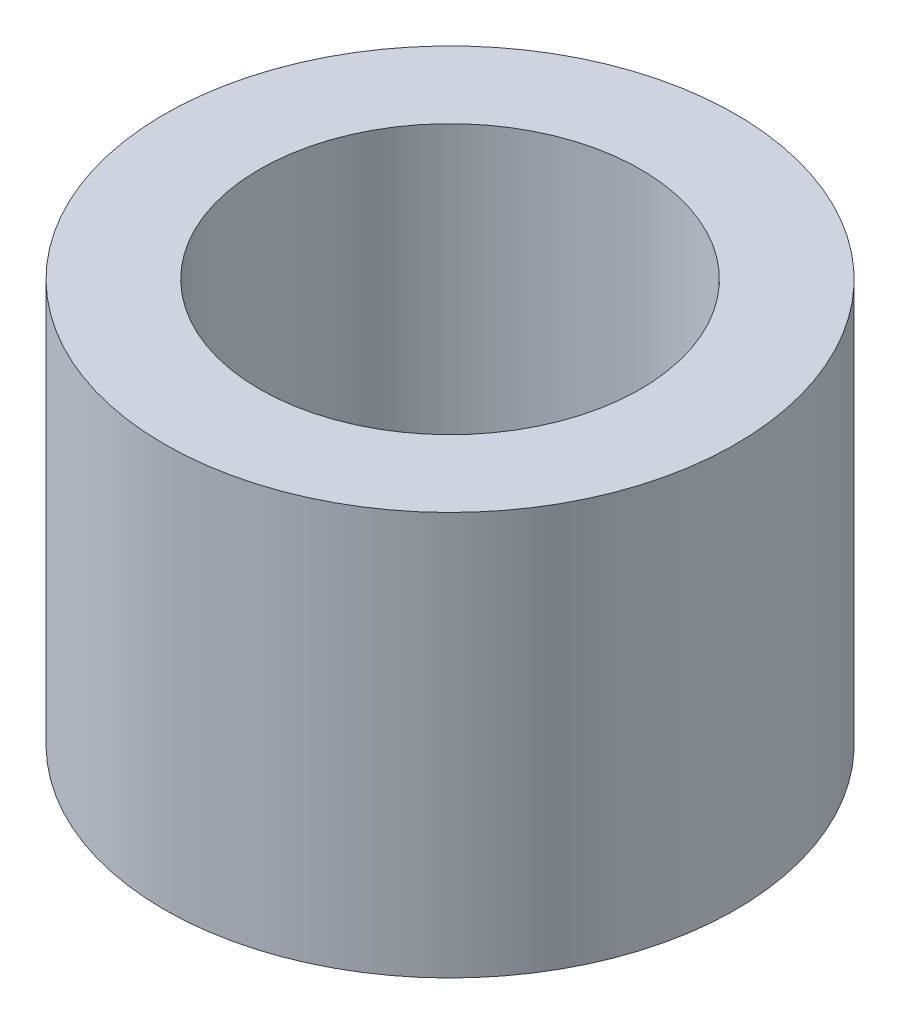
ISO-10303-21;
HEADER;
FILE_DESCRIPTION(('STEP AP214'),'2;1');
FILE_NAME('part.step','',(''),(''),'','','');
FILE_SCHEMA(('AUTOMOTIVE_DESIGN { 1 0 10303 214 1 1 1 1 }'));
ENDSEC;
DATA;
#1=APPLICATION_CONTEXT('core data for automotive mechanical design processes');
#2=APPLICATION_PROTOCOL_DEFINITION('international standard','automotive_design',2000,#1);
#3=PRODUCT_CONTEXT('',#1,'mechanical');
#4=PRODUCT('Part','Part','',(#3));
#5=PRODUCT_RELATED_PRODUCT_CATEGORY('part','',(#4));
#6=PRODUCT_DEFINITION_FORMATION('','',#4);
#7=PRODUCT_DEFINITION_CONTEXT('part definition',#1,'design');
#8=PRODUCT_DEFINITION('design','',#6,#7);
#9=PRODUCT_DEFINITION_SHAPE('','',#8);
#10=(LENGTH_UNIT() NAMED_UNIT(*) SI_UNIT(.MILLI.,.METRE.));
#11=(NAMED_UNIT(*) PLANE_ANGLE_UNIT() SI_UNIT($,.RADIAN.));
#12=(NAMED_UNIT(*) SI_UNIT($,.STERADIAN.) SOLID_ANGLE_UNIT());
#13=UNCERTAINTY_MEASURE_WITH_UNIT(LENGTH_MEASURE(1.E-05),#10,'distance_accuracy_value','');
#14=(GEOMETRIC_REPRESENTATION_CONTEXT(3) GLOBAL_UNCERTAINTY_ASSIGNED_CONTEXT((#13)) GLOBAL_UNIT_ASSIGNED_CONTEXT((#10,
#11,#12)) REPRESENTATION_CONTEXT('',''));
#15=CARTESIAN_POINT('',(0.,0.,0.));
#16=DIRECTION('',(0.,0.,1.));
#17=DIRECTION('',(1.,0.,0.));
#18=AXIS2_PLACEMENT_3D('',#15,#16,#17);
#19=CARTESIAN_POINT('',(0.,12.7,0.));
#20=DIRECTION('',(0.,1.,0.));
#21=DIRECTION('',(0.,0.,1.));
#22=AXIS2_PLACEMENT_3D('',#19,#20,#21);
#23=PLANE('',#22);
#24=CARTESIAN_POINT('',(0.,12.7,0.));
#25=DIRECTION('',(0.,1.,0.));
#26=DIRECTION('',(0.,0.,1.));
#27=AXIS2_PLACEMENT_3D('',#24,#25,#26);
#28=CIRCLE('',#27,9.);
#29=CARTESIAN_POINT('',(0.,12.7,9.));
#30=VERTEX_POINT('',#29);
#31=EDGE_CURVE('E10',#30,#30,#28,.T.);
#32=ORIENTED_EDGE('',*,*,#31,.T.);
#33=EDGE_LOOP('',(#32));
#34=FACE_BOUND('',#33,.T.);
#35=CARTESIAN_POINT('',(0.,12.7,0.));
#36=DIRECTION('',(0.,1.,0.));
#37=DIRECTION('',(0.,0.,1.));
#38=AXIS2_PLACEMENT_3D('',#35,#36,#37);
#39=CIRCLE('',#38,6.);
#40=CARTESIAN_POINT('',(0.,12.7,6.));
#41=VERTEX_POINT('',#40);
#42=EDGE_CURVE('E54',#41,#41,#39,.T.);
#43=ORIENTED_EDGE('',*,*,#42,.F.);
#44=EDGE_LOOP('',(#43));
#45=FACE_BOUND('',#44,.T.);
#46=ADVANCED_FACE('F41',(#34,#45),#23,.T.);
#47=CARTESIAN_POINT('',(0.,0.,0.));
#48=DIRECTION('',(0.,1.,0.));
#49=DIRECTION('',(0.,0.,1.));
#50=AXIS2_PLACEMENT_3D('',#47,#48,#49);
#51=PLANE('',#50);
#52=CARTESIAN_POINT('',(0.,0.,0.));
#53=DIRECTION('',(0.,1.,0.));
#54=DIRECTION('',(0.,0.,1.));
#55=AXIS2_PLACEMENT_3D('',#52,#53,#54);
#56=CIRCLE('',#55,9.);
#57=CARTESIAN_POINT('',(0.,0.,9.));
#58=VERTEX_POINT('',#57);
#59=EDGE_CURVE('E45',#58,#58,#56,.T.);
#60=ORIENTED_EDGE('',*,*,#59,.F.);
#61=EDGE_LOOP('',(#60));
#62=FACE_BOUND('',#61,.T.);
#63=CARTESIAN_POINT('',(0.,0.,0.));
#64=DIRECTION('',(0.,1.,0.));
#65=DIRECTION('',(0.,0.,1.));
#66=AXIS2_PLACEMENT_3D('',#63,#64,#65);
#67=CIRCLE('',#66,6.);
#68=CARTESIAN_POINT('',(0.,0.,6.));
#69=VERTEX_POINT('',#68);
#70=EDGE_CURVE('E56',#69,#69,#67,.T.);
#71=ORIENTED_EDGE('',*,*,#70,.T.);
#72=EDGE_LOOP('',(#71));
#73=FACE_BOUND('',#72,.T.);
#74=ADVANCED_FACE('F68',(#62,#73),#51,.F.);
#75=CARTESIAN_POINT('',(0.,12.7,0.));
#76=DIRECTION('',(0.,-1.,0.));
#77=DIRECTION('',(0.,0.,-1.));
#78=AXIS2_PLACEMENT_3D('',#75,#76,#77);
#79=CYLINDRICAL_SURFACE('',#78,9.);
#80=ORIENTED_EDGE('',*,*,#31,.F.);
#81=EDGE_LOOP('',(#80));
#82=FACE_BOUND('',#81,.T.);
#83=ORIENTED_EDGE('',*,*,#59,.T.);
#84=EDGE_LOOP('',(#83));
#85=FACE_BOUND('',#84,.T.);
#86=ADVANCED_FACE('F43',(#82,#85),#79,.T.);
#87=CARTESIAN_POINT('',(0.,12.7,0.));
#88=DIRECTION('',(0.,-1.,0.));
#89=DIRECTION('',(0.,0.,-1.));
#90=AXIS2_PLACEMENT_3D('',#87,#88,#89);
#91=CYLINDRICAL_SURFACE('',#90,6.);
#92=ORIENTED_EDGE('',*,*,#42,.T.);
#93=EDGE_LOOP('',(#92));
#94=FACE_BOUND('',#93,.T.);
#95=ORIENTED_EDGE('',*,*,#70,.F.);
#96=EDGE_LOOP('',(#95));
#97=FACE_BOUND('',#96,.T.);
#98=ADVANCED_FACE('F64',(#94,#97),#91,.F.);
#99=CLOSED_SHELL('',(#46,#74,#86,#98));
#100=MANIFOLD_SOLID_BREP('B2',#99);
#101=ADVANCED_BREP_SHAPE_REPRESENTATION('',(#18,#100),#14);
#102=SHAPE_DEFINITION_REPRESENTATION(#9,#101);
ENDSEC;
END-ISO-10303-21;
